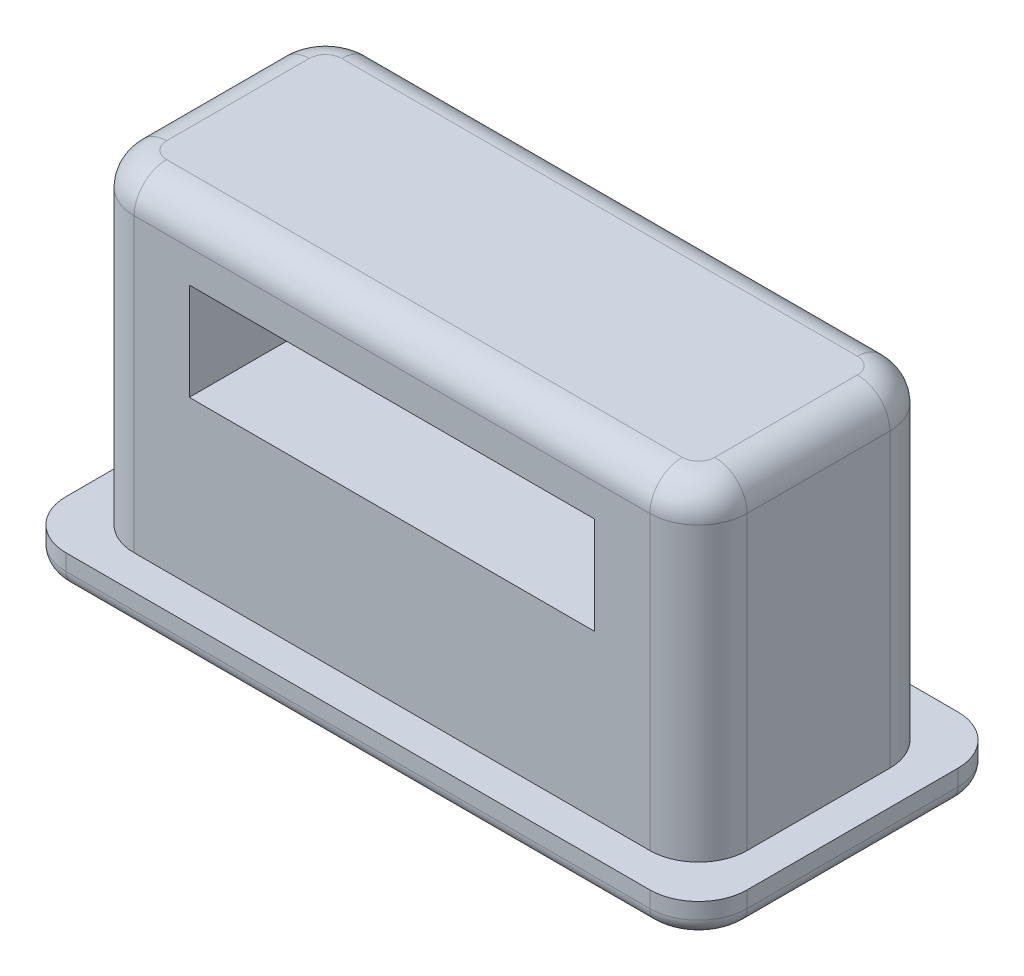
ISO-10303-21;
HEADER;
FILE_DESCRIPTION(('STEP AP214'),'2;1');
FILE_NAME('part.step','',(''),(''),'','','');
FILE_SCHEMA(('AUTOMOTIVE_DESIGN { 1 0 10303 214 1 1 1 1 }'));
ENDSEC;
DATA;
#1=APPLICATION_CONTEXT('core data for automotive mechanical design processes');
#2=APPLICATION_PROTOCOL_DEFINITION('international standard','automotive_design',2000,#1);
#3=PRODUCT_CONTEXT('',#1,'mechanical');
#4=PRODUCT('Part','Part','',(#3));
#5=PRODUCT_RELATED_PRODUCT_CATEGORY('part','',(#4));
#6=PRODUCT_DEFINITION_FORMATION('','',#4);
#7=PRODUCT_DEFINITION_CONTEXT('part definition',#1,'design');
#8=PRODUCT_DEFINITION('design','',#6,#7);
#9=PRODUCT_DEFINITION_SHAPE('','',#8);
#10=(LENGTH_UNIT() NAMED_UNIT(*) SI_UNIT(.MILLI.,.METRE.));
#11=(NAMED_UNIT(*) PLANE_ANGLE_UNIT() SI_UNIT($,.RADIAN.));
#12=(NAMED_UNIT(*) SI_UNIT($,.STERADIAN.) SOLID_ANGLE_UNIT());
#13=UNCERTAINTY_MEASURE_WITH_UNIT(LENGTH_MEASURE(1.E-05),#10,'distance_accuracy_value','');
#14=(GEOMETRIC_REPRESENTATION_CONTEXT(3) GLOBAL_UNCERTAINTY_ASSIGNED_CONTEXT((#13)) GLOBAL_UNIT_ASSIGNED_CONTEXT((#10,
#11,#12)) REPRESENTATION_CONTEXT('',''));
#15=CARTESIAN_POINT('',(0.,0.,0.));
#16=DIRECTION('',(0.,0.,1.));
#17=DIRECTION('',(1.,0.,0.));
#18=AXIS2_PLACEMENT_3D('',#15,#16,#17);
#19=CARTESIAN_POINT('',(-48.247676633875,22.,-13.3605958166485));
#20=DIRECTION('',(-1.,0.,0.));
#21=DIRECTION('',(0.,0.,1.));
#22=AXIS2_PLACEMENT_3D('',#19,#20,#21);
#23=PLANE('',#22);
#24=DIRECTION('',(0.,0.,-1.));
#25=VECTOR('',#24,1.);
#26=CARTESIAN_POINT('',(-48.247676633875,18.,1.43940418335151));
#27=LINE('',#26,#25);
#28=CARTESIAN_POINT('',(-48.247676633875,18.,1.43940418335151));
#29=VERTEX_POINT('',#28);
#30=CARTESIAN_POINT('',(-48.247676633875,18.,-13.3605958166485));
#31=VERTEX_POINT('',#30);
#32=EDGE_CURVE('E240',#29,#31,#27,.T.);
#33=ORIENTED_EDGE('',*,*,#32,.F.);
#34=DIRECTION('',(0.,-1.,0.));
#35=VECTOR('',#34,1.);
#36=CARTESIAN_POINT('',(-48.247676633875,22.,1.43940418335151));
#37=LINE('',#36,#35);
#38=CARTESIAN_POINT('',(-48.247676633875,12.,1.43940418335151));
#39=VERTEX_POINT('',#38);
#40=EDGE_CURVE('E239',#29,#39,#37,.T.);
#41=ORIENTED_EDGE('',*,*,#40,.T.);
#42=DIRECTION('',(0.,0.,-1.));
#43=VECTOR('',#42,1.);
#44=CARTESIAN_POINT('',(-48.247676633875,12.,-13.3605958166485));
#45=LINE('',#44,#43);
#46=CARTESIAN_POINT('',(-48.247676633875,12.,-13.3605958166485));
#47=VERTEX_POINT('',#46);
#48=EDGE_CURVE('E245',#39,#47,#45,.T.);
#49=ORIENTED_EDGE('',*,*,#48,.T.);
#50=DIRECTION('',(0.,-1.,0.));
#51=VECTOR('',#50,1.);
#52=CARTESIAN_POINT('',(-48.247676633875,22.,-13.3605958166485));
#53=LINE('',#52,#51);
#54=EDGE_CURVE('E267',#31,#47,#53,.T.);
#55=ORIENTED_EDGE('',*,*,#54,.F.);
#56=EDGE_LOOP('',(#33,#41,#49,#55));
#57=FACE_BOUND('',#56,.T.);
#58=ADVANCED_FACE('F34',(#57),#23,.F.);
#59=CARTESIAN_POINT('',(-23.247676633875,22.,-13.3605958166485));
#60=DIRECTION('',(1.,0.,0.));
#61=DIRECTION('',(0.,0.,-1.));
#62=AXIS2_PLACEMENT_3D('',#59,#60,#61);
#63=PLANE('',#62);
#64=DIRECTION('',(0.,0.,-1.));
#65=VECTOR('',#64,1.);
#66=CARTESIAN_POINT('',(-23.247676633875,18.,1.43940418335151));
#67=LINE('',#66,#65);
#68=CARTESIAN_POINT('',(-23.247676633875,18.,1.43940418335151));
#69=VERTEX_POINT('',#68);
#70=CARTESIAN_POINT('',(-23.247676633875,18.,-13.3605958166485));
#71=VERTEX_POINT('',#70);
#72=EDGE_CURVE('E220',#69,#71,#67,.T.);
#73=ORIENTED_EDGE('',*,*,#72,.T.);
#74=DIRECTION('',(0.,-1.,0.));
#75=VECTOR('',#74,1.);
#76=CARTESIAN_POINT('',(-23.247676633875,22.,-13.3605958166485));
#77=LINE('',#76,#75);
#78=CARTESIAN_POINT('',(-23.247676633875,12.,-13.3605958166485));
#79=VERTEX_POINT('',#78);
#80=EDGE_CURVE('E246',#71,#79,#77,.T.);
#81=ORIENTED_EDGE('',*,*,#80,.T.);
#82=DIRECTION('',(0.,0.,1.));
#83=VECTOR('',#82,1.);
#84=CARTESIAN_POINT('',(-23.247676633875,12.,-13.3605958166485));
#85=LINE('',#84,#83);
#86=CARTESIAN_POINT('',(-23.247676633875,12.,1.43940418335151));
#87=VERTEX_POINT('',#86);
#88=EDGE_CURVE('E230',#79,#87,#85,.T.);
#89=ORIENTED_EDGE('',*,*,#88,.T.);
#90=DIRECTION('',(0.,-1.,0.));
#91=VECTOR('',#90,1.);
#92=CARTESIAN_POINT('',(-23.247676633875,22.,1.43940418335151));
#93=LINE('',#92,#91);
#94=EDGE_CURVE('E237',#69,#87,#93,.T.);
#95=ORIENTED_EDGE('',*,*,#94,.F.);
#96=EDGE_LOOP('',(#73,#81,#89,#95));
#97=FACE_BOUND('',#96,.T.);
#98=ADVANCED_FACE('F243',(#97),#63,.F.);
#99=CARTESIAN_POINT('',(0.,12.,0.));
#100=DIRECTION('',(0.,1.,0.));
#101=DIRECTION('',(0.,0.,1.));
#102=AXIS2_PLACEMENT_3D('',#99,#100,#101);
#103=PLANE('',#102);
#104=DIRECTION('',(1.,0.,0.));
#105=VECTOR('',#104,1.);
#106=CARTESIAN_POINT('',(-54.647676633875,12.,1.43940418335151));
#107=LINE('',#106,#105);
#108=EDGE_CURVE('E378',#39,#87,#107,.T.);
#109=ORIENTED_EDGE('',*,*,#108,.T.);
#110=ORIENTED_EDGE('',*,*,#88,.F.);
#111=DIRECTION('',(-1.,0.,0.));
#112=VECTOR('',#111,1.);
#113=CARTESIAN_POINT('',(-54.647676633875,12.,-13.3605958166485));
#114=LINE('',#113,#112);
#115=EDGE_CURVE('E263',#79,#47,#114,.T.);
#116=ORIENTED_EDGE('',*,*,#115,.T.);
#117=ORIENTED_EDGE('',*,*,#48,.F.);
#118=EDGE_LOOP('',(#109,#110,#116,#117));
#119=FACE_BOUND('',#118,.T.);
#120=ADVANCED_FACE('F477',(#119),#103,.T.);
#121=CARTESIAN_POINT('',(0.,2.,0.));
#122=DIRECTION('',(0.,1.,0.));
#123=DIRECTION('',(0.,0.,1.));
#124=AXIS2_PLACEMENT_3D('',#121,#122,#123);
#125=PLANE('',#124);
#126=DIRECTION('',(-1.,0.,0.));
#127=VECTOR('',#126,1.);
#128=CARTESIAN_POINT('',(-56.747676633875,2.,-15.4605958166485));
#129=LINE('',#128,#127);
#130=CARTESIAN_POINT('',(-17.747676633875,2.,-15.4605958166485));
#131=VERTEX_POINT('',#130);
#132=CARTESIAN_POINT('',(-53.747676633875,2.,-15.4605958166485));
#133=VERTEX_POINT('',#132);
#134=EDGE_CURVE('E389',#131,#133,#129,.T.);
#135=ORIENTED_EDGE('',*,*,#134,.T.);
#136=CARTESIAN_POINT('',(-53.747676633875,2.,-12.4605958166485));
#137=DIRECTION('',(0.,1.,0.));
#138=DIRECTION('',(0.,0.,1.));
#139=AXIS2_PLACEMENT_3D('',#136,#137,#138);
#140=CIRCLE('',#139,3.);
#141=CARTESIAN_POINT('',(-56.747676633875,2.,-12.4605958166485));
#142=VERTEX_POINT('',#141);
#143=EDGE_CURVE('E408',#133,#142,#140,.T.);
#144=ORIENTED_EDGE('',*,*,#143,.T.);
#145=DIRECTION('',(0.,0.,1.));
#146=VECTOR('',#145,1.);
#147=CARTESIAN_POINT('',(-56.747676633875,2.,-15.4605958166485));
#148=LINE('',#147,#146);
#149=CARTESIAN_POINT('',(-56.747676633875,2.,0.539404183351508));
#150=VERTEX_POINT('',#149);
#151=EDGE_CURVE('E379',#142,#150,#148,.T.);
#152=ORIENTED_EDGE('',*,*,#151,.T.);
#153=CARTESIAN_POINT('',(-53.747676633875,2.,0.539404183351507));
#154=DIRECTION('',(0.,1.,0.));
#155=DIRECTION('',(0.,0.,1.));
#156=AXIS2_PLACEMENT_3D('',#153,#154,#155);
#157=CIRCLE('',#156,3.);
#158=CARTESIAN_POINT('',(-53.747676633875,2.,3.53940418335151));
#159=VERTEX_POINT('',#158);
#160=EDGE_CURVE('E406',#150,#159,#157,.T.);
#161=ORIENTED_EDGE('',*,*,#160,.T.);
#162=DIRECTION('',(1.,0.,0.));
#163=VECTOR('',#162,1.);
#164=CARTESIAN_POINT('',(-56.747676633875,2.,3.53940418335151));
#165=LINE('',#164,#163);
#166=CARTESIAN_POINT('',(-17.747676633875,2.,3.53940418335151));
#167=VERTEX_POINT('',#166);
#168=EDGE_CURVE('E382',#159,#167,#165,.T.);
#169=ORIENTED_EDGE('',*,*,#168,.T.);
#170=CARTESIAN_POINT('',(-17.747676633875,2.,0.539404183351508));
#171=DIRECTION('',(0.,1.,0.));
#172=DIRECTION('',(0.,0.,1.));
#173=AXIS2_PLACEMENT_3D('',#170,#171,#172);
#174=CIRCLE('',#173,3.);
#175=CARTESIAN_POINT('',(-14.747676633875,2.,0.539404183351508));
#176=VERTEX_POINT('',#175);
#177=EDGE_CURVE('E402',#167,#176,#174,.T.);
#178=ORIENTED_EDGE('',*,*,#177,.T.);
#179=DIRECTION('',(0.,0.,-1.));
#180=VECTOR('',#179,1.);
#181=CARTESIAN_POINT('',(-14.747676633875,2.,-15.4605958166485));
#182=LINE('',#181,#180);
#183=CARTESIAN_POINT('',(-14.747676633875,2.,-12.4605958166485));
#184=VERTEX_POINT('',#183);
#185=EDGE_CURVE('E386',#176,#184,#182,.T.);
#186=ORIENTED_EDGE('',*,*,#185,.T.);
#187=CARTESIAN_POINT('',(-17.747676633875,2.,-12.4605958166485));
#188=DIRECTION('',(0.,1.,0.));
#189=DIRECTION('',(0.,0.,1.));
#190=AXIS2_PLACEMENT_3D('',#187,#188,#189);
#191=CIRCLE('',#190,3.);
#192=EDGE_CURVE('E404',#184,#131,#191,.T.);
#193=ORIENTED_EDGE('',*,*,#192,.T.);
#194=EDGE_LOOP('',(#135,#144,#152,#161,#169,#178,#186,#193));
#195=FACE_BOUND('',#194,.T.);
#196=DIRECTION('',(1.,0.,0.));
#197=VECTOR('',#196,1.);
#198=CARTESIAN_POINT('',(-54.647676633875,2.,1.43940418335151));
#199=LINE('',#198,#197);
#200=CARTESIAN_POINT('',(-51.647676633875,2.,1.43940418335151));
#201=VERTEX_POINT('',#200);
#202=CARTESIAN_POINT('',(-19.847676633875,2.,1.43940418335151));
#203=VERTEX_POINT('',#202);
#204=EDGE_CURVE('E366',#201,#203,#199,.T.);
#205=ORIENTED_EDGE('',*,*,#204,.F.);
#206=CARTESIAN_POINT('',(-51.647676633875,2.,-1.56059581664849));
#207=DIRECTION('',(0.,1.,0.));
#208=DIRECTION('',(0.,0.,1.));
#209=AXIS2_PLACEMENT_3D('',#206,#207,#208);
#210=CIRCLE('',#209,3.);
#211=CARTESIAN_POINT('',(-54.647676633875,2.,-1.56059581664849));
#212=VERTEX_POINT('',#211);
#213=EDGE_CURVE('E293',#201,#212,#210,.F.);
#214=ORIENTED_EDGE('',*,*,#213,.T.);
#215=DIRECTION('',(0.,0.,1.));
#216=VECTOR('',#215,1.);
#217=CARTESIAN_POINT('',(-54.647676633875,2.,-13.3605958166485));
#218=LINE('',#217,#216);
#219=CARTESIAN_POINT('',(-54.647676633875,2.,-10.3605958166485));
#220=VERTEX_POINT('',#219);
#221=EDGE_CURVE('E363',#220,#212,#218,.T.);
#222=ORIENTED_EDGE('',*,*,#221,.F.);
#223=CARTESIAN_POINT('',(-51.647676633875,2.,-10.3605958166485));
#224=DIRECTION('',(0.,1.,0.));
#225=DIRECTION('',(0.,0.,1.));
#226=AXIS2_PLACEMENT_3D('',#223,#224,#225);
#227=CIRCLE('',#226,3.);
#228=CARTESIAN_POINT('',(-51.647676633875,2.,-13.3605958166485));
#229=VERTEX_POINT('',#228);
#230=EDGE_CURVE('E291',#220,#229,#227,.F.);
#231=ORIENTED_EDGE('',*,*,#230,.T.);
#232=DIRECTION('',(-1.,0.,0.));
#233=VECTOR('',#232,1.);
#234=CARTESIAN_POINT('',(-54.647676633875,2.,-13.3605958166485));
#235=LINE('',#234,#233);
#236=CARTESIAN_POINT('',(-19.847676633875,2.,-13.3605958166485));
#237=VERTEX_POINT('',#236);
#238=EDGE_CURVE('E375',#237,#229,#235,.T.);
#239=ORIENTED_EDGE('',*,*,#238,.F.);
#240=CARTESIAN_POINT('',(-19.847676633875,2.,-10.3605958166485));
#241=DIRECTION('',(0.,1.,0.));
#242=DIRECTION('',(0.,0.,1.));
#243=AXIS2_PLACEMENT_3D('',#240,#241,#242);
#244=CIRCLE('',#243,3.);
#245=CARTESIAN_POINT('',(-16.847676633875,2.,-10.3605958166485));
#246=VERTEX_POINT('',#245);
#247=EDGE_CURVE('E287',#237,#246,#244,.F.);
#248=ORIENTED_EDGE('',*,*,#247,.T.);
#249=DIRECTION('',(0.,0.,-1.));
#250=VECTOR('',#249,1.);
#251=CARTESIAN_POINT('',(-16.847676633875,2.,-13.3605958166485));
#252=LINE('',#251,#250);
#253=CARTESIAN_POINT('',(-16.847676633875,2.,-1.56059581664849));
#254=VERTEX_POINT('',#253);
#255=EDGE_CURVE('E369',#254,#246,#252,.T.);
#256=ORIENTED_EDGE('',*,*,#255,.F.);
#257=CARTESIAN_POINT('',(-19.847676633875,2.,-1.56059581664849));
#258=DIRECTION('',(0.,1.,0.));
#259=DIRECTION('',(0.,0.,1.));
#260=AXIS2_PLACEMENT_3D('',#257,#258,#259);
#261=CIRCLE('',#260,3.);
#262=EDGE_CURVE('E289',#254,#203,#261,.F.);
#263=ORIENTED_EDGE('',*,*,#262,.T.);
#264=EDGE_LOOP('',(#205,#214,#222,#231,#239,#248,#256,#263));
#265=FACE_BOUND('',#264,.T.);
#266=ADVANCED_FACE('F515',(#195,#265),#125,.T.);
#267=CARTESIAN_POINT('',(-56.747676633875,2.,-15.4605958166485));
#268=DIRECTION('',(1.,0.,0.));
#269=DIRECTION('',(0.,0.,-1.));
#270=AXIS2_PLACEMENT_3D('',#267,#268,#269);
#271=PLANE('',#270);
#272=DIRECTION('',(0.,-1.,0.));
#273=VECTOR('',#272,1.);
#274=CARTESIAN_POINT('',(-56.747676633875,2.,-12.4605958166485));
#275=LINE('',#274,#273);
#276=CARTESIAN_POINT('',(-56.747676633875,1.,-12.4605958166485));
#277=VERTEX_POINT('',#276);
#278=EDGE_CURVE('E394',#142,#277,#275,.T.);
#279=ORIENTED_EDGE('',*,*,#278,.T.);
#280=DIRECTION('',(0.,0.,1.));
#281=VECTOR('',#280,1.);
#282=CARTESIAN_POINT('',(-56.747676633875,1.,-15.4605958166485));
#283=LINE('',#282,#281);
#284=CARTESIAN_POINT('',(-56.747676633875,1.,0.539404183351508));
#285=VERTEX_POINT('',#284);
#286=EDGE_CURVE('E440',#277,#285,#283,.T.);
#287=ORIENTED_EDGE('',*,*,#286,.T.);
#288=DIRECTION('',(0.,-1.,0.));
#289=VECTOR('',#288,1.);
#290=CARTESIAN_POINT('',(-56.747676633875,2.,0.539404183351508));
#291=LINE('',#290,#289);
#292=EDGE_CURVE('E392',#285,#150,#291,.F.);
#293=ORIENTED_EDGE('',*,*,#292,.T.);
#294=ORIENTED_EDGE('',*,*,#151,.F.);
#295=EDGE_LOOP('',(#279,#287,#293,#294));
#296=FACE_BOUND('',#295,.T.);
#297=ADVANCED_FACE('F552',(#296),#271,.F.);
#298=CARTESIAN_POINT('',(-56.747676633875,2.,3.53940418335151));
#299=DIRECTION('',(0.,0.,-1.));
#300=DIRECTION('',(-1.,0.,0.));
#301=AXIS2_PLACEMENT_3D('',#298,#299,#300);
#302=PLANE('',#301);
#303=DIRECTION('',(0.,-1.,0.));
#304=VECTOR('',#303,1.);
#305=CARTESIAN_POINT('',(-53.747676633875,2.,3.53940418335151));
#306=LINE('',#305,#304);
#307=CARTESIAN_POINT('',(-53.747676633875,1.,3.53940418335151));
#308=VERTEX_POINT('',#307);
#309=EDGE_CURVE('E412',#159,#308,#306,.T.);
#310=ORIENTED_EDGE('',*,*,#309,.T.);
#311=DIRECTION('',(1.,0.,0.));
#312=VECTOR('',#311,1.);
#313=CARTESIAN_POINT('',(-56.747676633875,1.,3.53940418335151));
#314=LINE('',#313,#312);
#315=CARTESIAN_POINT('',(-17.747676633875,1.,3.53940418335151));
#316=VERTEX_POINT('',#315);
#317=EDGE_CURVE('E271',#308,#316,#314,.T.);
#318=ORIENTED_EDGE('',*,*,#317,.T.);
#319=DIRECTION('',(0.,-1.,0.));
#320=VECTOR('',#319,1.);
#321=CARTESIAN_POINT('',(-17.747676633875,2.,3.53940418335151));
#322=LINE('',#321,#320);
#323=EDGE_CURVE('E410',#316,#167,#322,.F.);
#324=ORIENTED_EDGE('',*,*,#323,.T.);
#325=ORIENTED_EDGE('',*,*,#168,.F.);
#326=EDGE_LOOP('',(#310,#318,#324,#325));
#327=FACE_BOUND('',#326,.T.);
#328=ADVANCED_FACE('F558',(#327),#302,.F.);
#329=CARTESIAN_POINT('',(-14.747676633875,2.,-15.4605958166485));
#330=DIRECTION('',(-1.,0.,0.));
#331=DIRECTION('',(0.,0.,1.));
#332=AXIS2_PLACEMENT_3D('',#329,#330,#331);
#333=PLANE('',#332);
#334=DIRECTION('',(0.,-1.,0.));
#335=VECTOR('',#334,1.);
#336=CARTESIAN_POINT('',(-14.747676633875,2.,0.539404183351508));
#337=LINE('',#336,#335);
#338=CARTESIAN_POINT('',(-14.747676633875,1.,0.539404183351508));
#339=VERTEX_POINT('',#338);
#340=EDGE_CURVE('E415',#176,#339,#337,.T.);
#341=ORIENTED_EDGE('',*,*,#340,.T.);
#342=DIRECTION('',(0.,0.,-1.));
#343=VECTOR('',#342,1.);
#344=CARTESIAN_POINT('',(-14.747676633875,1.,-15.4605958166485));
#345=LINE('',#344,#343);
#346=CARTESIAN_POINT('',(-14.747676633875,1.,-12.4605958166485));
#347=VERTEX_POINT('',#346);
#348=EDGE_CURVE('E448',#339,#347,#345,.T.);
#349=ORIENTED_EDGE('',*,*,#348,.T.);
#350=DIRECTION('',(0.,-1.,0.));
#351=VECTOR('',#350,1.);
#352=CARTESIAN_POINT('',(-14.747676633875,2.,-12.4605958166485));
#353=LINE('',#352,#351);
#354=EDGE_CURVE('E418',#347,#184,#353,.F.);
#355=ORIENTED_EDGE('',*,*,#354,.T.);
#356=ORIENTED_EDGE('',*,*,#185,.F.);
#357=EDGE_LOOP('',(#341,#349,#355,#356));
#358=FACE_BOUND('',#357,.T.);
#359=ADVANCED_FACE('F570',(#358),#333,.F.);
#360=CARTESIAN_POINT('',(-56.747676633875,2.,-15.4605958166485));
#361=DIRECTION('',(0.,0.,1.));
#362=DIRECTION('',(1.,0.,0.));
#363=AXIS2_PLACEMENT_3D('',#360,#361,#362);
#364=PLANE('',#363);
#365=DIRECTION('',(0.,-1.,0.));
#366=VECTOR('',#365,1.);
#367=CARTESIAN_POINT('',(-17.747676633875,2.,-15.4605958166485));
#368=LINE('',#367,#366);
#369=CARTESIAN_POINT('',(-17.747676633875,1.,-15.4605958166485));
#370=VERTEX_POINT('',#369);
#371=EDGE_CURVE('E397',#131,#370,#368,.T.);
#372=ORIENTED_EDGE('',*,*,#371,.T.);
#373=DIRECTION('',(-1.,0.,0.));
#374=VECTOR('',#373,1.);
#375=CARTESIAN_POINT('',(-56.747676633875,1.,-15.4605958166485));
#376=LINE('',#375,#374);
#377=CARTESIAN_POINT('',(-53.747676633875,1.,-15.4605958166485));
#378=VERTEX_POINT('',#377);
#379=EDGE_CURVE('E444',#370,#378,#376,.T.);
#380=ORIENTED_EDGE('',*,*,#379,.T.);
#381=DIRECTION('',(0.,-1.,0.));
#382=VECTOR('',#381,1.);
#383=CARTESIAN_POINT('',(-53.747676633875,2.,-15.4605958166485));
#384=LINE('',#383,#382);
#385=EDGE_CURVE('E400',#378,#133,#384,.F.);
#386=ORIENTED_EDGE('',*,*,#385,.T.);
#387=ORIENTED_EDGE('',*,*,#134,.F.);
#388=EDGE_LOOP('',(#372,#380,#386,#387));
#389=FACE_BOUND('',#388,.T.);
#390=ADVANCED_FACE('F566',(#389),#364,.F.);
#391=CARTESIAN_POINT('',(0.,0.,0.));
#392=DIRECTION('',(0.,1.,0.));
#393=DIRECTION('',(0.,0.,1.));
#394=AXIS2_PLACEMENT_3D('',#391,#392,#393);
#395=PLANE('',#394);
#396=DIRECTION('',(1.,0.,0.));
#397=VECTOR('',#396,1.);
#398=CARTESIAN_POINT('',(0.,0.,2.53940418335151));
#399=LINE('',#398,#397);
#400=CARTESIAN_POINT('',(-17.747676633875,0.,2.53940418335151));
#401=VERTEX_POINT('',#400);
#402=CARTESIAN_POINT('',(-53.747676633875,0.,2.53940418335151));
#403=VERTEX_POINT('',#402);
#404=EDGE_CURVE('E420',#401,#403,#399,.F.);
#405=ORIENTED_EDGE('',*,*,#404,.T.);
#406=CARTESIAN_POINT('',(-53.747676633875,0.,0.539404183351507));
#407=DIRECTION('',(0.,1.,0.));
#408=DIRECTION('',(0.,0.,1.));
#409=AXIS2_PLACEMENT_3D('',#406,#407,#408);
#410=CIRCLE('',#409,2.);
#411=CARTESIAN_POINT('',(-55.747676633875,0.,0.539404183351508));
#412=VERTEX_POINT('',#411);
#413=EDGE_CURVE('E434',#403,#412,#410,.F.);
#414=ORIENTED_EDGE('',*,*,#413,.T.);
#415=DIRECTION('',(0.,0.,1.));
#416=VECTOR('',#415,1.);
#417=CARTESIAN_POINT('',(-55.747676633875,0.,0.));
#418=LINE('',#417,#416);
#419=CARTESIAN_POINT('',(-55.747676633875,0.,-12.4605958166485));
#420=VERTEX_POINT('',#419);
#421=EDGE_CURVE('E432',#412,#420,#418,.F.);
#422=ORIENTED_EDGE('',*,*,#421,.T.);
#423=CARTESIAN_POINT('',(-53.747676633875,0.,-12.4605958166485));
#424=DIRECTION('',(0.,1.,0.));
#425=DIRECTION('',(0.,0.,1.));
#426=AXIS2_PLACEMENT_3D('',#423,#424,#425);
#427=CIRCLE('',#426,2.);
#428=CARTESIAN_POINT('',(-53.747676633875,0.,-14.4605958166485));
#429=VERTEX_POINT('',#428);
#430=EDGE_CURVE('E430',#420,#429,#427,.F.);
#431=ORIENTED_EDGE('',*,*,#430,.T.);
#432=DIRECTION('',(-1.,0.,0.));
#433=VECTOR('',#432,1.);
#434=CARTESIAN_POINT('',(0.,0.,-14.4605958166485));
#435=LINE('',#434,#433);
#436=CARTESIAN_POINT('',(-17.747676633875,0.,-14.4605958166485));
#437=VERTEX_POINT('',#436);
#438=EDGE_CURVE('E428',#429,#437,#435,.F.);
#439=ORIENTED_EDGE('',*,*,#438,.T.);
#440=CARTESIAN_POINT('',(-17.747676633875,0.,-12.4605958166485));
#441=DIRECTION('',(0.,1.,0.));
#442=DIRECTION('',(0.,0.,1.));
#443=AXIS2_PLACEMENT_3D('',#440,#441,#442);
#444=CIRCLE('',#443,2.);
#445=CARTESIAN_POINT('',(-15.747676633875,0.,-12.4605958166485));
#446=VERTEX_POINT('',#445);
#447=EDGE_CURVE('E426',#437,#446,#444,.F.);
#448=ORIENTED_EDGE('',*,*,#447,.T.);
#449=DIRECTION('',(0.,0.,-1.));
#450=VECTOR('',#449,1.);
#451=CARTESIAN_POINT('',(-15.747676633875,0.,0.));
#452=LINE('',#451,#450);
#453=CARTESIAN_POINT('',(-15.747676633875,0.,0.539404183351508));
#454=VERTEX_POINT('',#453);
#455=EDGE_CURVE('E424',#446,#454,#452,.F.);
#456=ORIENTED_EDGE('',*,*,#455,.T.);
#457=CARTESIAN_POINT('',(-17.747676633875,0.,0.539404183351508));
#458=DIRECTION('',(0.,1.,0.));
#459=DIRECTION('',(0.,0.,1.));
#460=AXIS2_PLACEMENT_3D('',#457,#458,#459);
#461=CIRCLE('',#460,2.);
#462=EDGE_CURVE('E422',#454,#401,#461,.F.);
#463=ORIENTED_EDGE('',*,*,#462,.T.);
#464=EDGE_LOOP('',(#405,#414,#422,#431,#439,#448,#456,#463));
#465=FACE_BOUND('',#464,.T.);
#466=ADVANCED_FACE('F562',(#465),#395,.F.);
#467=CARTESIAN_POINT('',(-53.747676633875,2.,-12.4605958166485));
#468=DIRECTION('',(0.,-1.,0.));
#469=DIRECTION('',(0.,0.,-1.));
#470=AXIS2_PLACEMENT_3D('',#467,#468,#469);
#471=CYLINDRICAL_SURFACE('',#470,3.);
#472=ORIENTED_EDGE('',*,*,#385,.F.);
#473=CARTESIAN_POINT('',(-53.747676633875,1.,-12.4605958166485));
#474=DIRECTION('',(0.,1.,0.));
#475=DIRECTION('',(0.,0.,1.));
#476=AXIS2_PLACEMENT_3D('',#473,#474,#475);
#477=CIRCLE('',#476,3.);
#478=EDGE_CURVE('E442',#378,#277,#477,.T.);
#479=ORIENTED_EDGE('',*,*,#478,.T.);
#480=ORIENTED_EDGE('',*,*,#278,.F.);
#481=ORIENTED_EDGE('',*,*,#143,.F.);
#482=EDGE_LOOP('',(#472,#479,#480,#481));
#483=FACE_BOUND('',#482,.T.);
#484=ADVANCED_FACE('F565',(#483),#471,.T.);
#485=CARTESIAN_POINT('',(-53.747676633875,2.,0.539404183351507));
#486=DIRECTION('',(0.,-1.,0.));
#487=DIRECTION('',(0.,0.,-1.));
#488=AXIS2_PLACEMENT_3D('',#485,#486,#487);
#489=CYLINDRICAL_SURFACE('',#488,3.);
#490=ORIENTED_EDGE('',*,*,#292,.F.);
#491=CARTESIAN_POINT('',(-53.747676633875,1.,0.539404183351507));
#492=DIRECTION('',(0.,1.,0.));
#493=DIRECTION('',(0.,0.,1.));
#494=AXIS2_PLACEMENT_3D('',#491,#492,#493);
#495=CIRCLE('',#494,3.);
#496=EDGE_CURVE('E437',#285,#308,#495,.T.);
#497=ORIENTED_EDGE('',*,*,#496,.T.);
#498=ORIENTED_EDGE('',*,*,#309,.F.);
#499=ORIENTED_EDGE('',*,*,#160,.F.);
#500=EDGE_LOOP('',(#490,#497,#498,#499));
#501=FACE_BOUND('',#500,.T.);
#502=ADVANCED_FACE('F580',(#501),#489,.T.);
#503=CARTESIAN_POINT('',(-17.747676633875,2.,-12.4605958166485));
#504=DIRECTION('',(0.,-1.,0.));
#505=DIRECTION('',(0.,0.,-1.));
#506=AXIS2_PLACEMENT_3D('',#503,#504,#505);
#507=CYLINDRICAL_SURFACE('',#506,3.);
#508=ORIENTED_EDGE('',*,*,#354,.F.);
#509=CARTESIAN_POINT('',(-17.747676633875,1.,-12.4605958166485));
#510=DIRECTION('',(0.,1.,0.));
#511=DIRECTION('',(0.,0.,1.));
#512=AXIS2_PLACEMENT_3D('',#509,#510,#511);
#513=CIRCLE('',#512,3.);
#514=EDGE_CURVE('E446',#347,#370,#513,.T.);
#515=ORIENTED_EDGE('',*,*,#514,.T.);
#516=ORIENTED_EDGE('',*,*,#371,.F.);
#517=ORIENTED_EDGE('',*,*,#192,.F.);
#518=EDGE_LOOP('',(#508,#515,#516,#517));
#519=FACE_BOUND('',#518,.T.);
#520=ADVANCED_FACE('F584',(#519),#507,.T.);
#521=CARTESIAN_POINT('',(-17.747676633875,2.,0.539404183351508));
#522=DIRECTION('',(0.,-1.,0.));
#523=DIRECTION('',(0.,0.,-1.));
#524=AXIS2_PLACEMENT_3D('',#521,#522,#523);
#525=CYLINDRICAL_SURFACE('',#524,3.);
#526=ORIENTED_EDGE('',*,*,#323,.F.);
#527=CARTESIAN_POINT('',(-17.747676633875,1.,0.539404183351508));
#528=DIRECTION('',(0.,1.,0.));
#529=DIRECTION('',(0.,0.,1.));
#530=AXIS2_PLACEMENT_3D('',#527,#528,#529);
#531=CIRCLE('',#530,3.);
#532=EDGE_CURVE('E450',#316,#339,#531,.T.);
#533=ORIENTED_EDGE('',*,*,#532,.T.);
#534=ORIENTED_EDGE('',*,*,#340,.F.);
#535=ORIENTED_EDGE('',*,*,#177,.F.);
#536=EDGE_LOOP('',(#526,#533,#534,#535));
#537=FACE_BOUND('',#536,.T.);
#538=ADVANCED_FACE('F588',(#537),#525,.T.);
#539=CARTESIAN_POINT('',(-17.747676633875,1.,-12.4605958166485));
#540=DIRECTION('',(0.,1.,0.));
#541=DIRECTION('',(0.,0.,1.));
#542=AXIS2_PLACEMENT_3D('',#539,#540,#541);
#543=TOROIDAL_SURFACE('',#542,2.,1.);
#544=CARTESIAN_POINT('',(-17.747676633875,1.,-14.4605958166485));
#545=DIRECTION('',(-1.,0.,0.));
#546=DIRECTION('',(0.,0.,1.));
#547=AXIS2_PLACEMENT_3D('',#544,#545,#546);
#548=CIRCLE('',#547,1.);
#549=EDGE_CURVE('E469',#370,#437,#548,.T.);
#550=ORIENTED_EDGE('',*,*,#549,.F.);
#551=ORIENTED_EDGE('',*,*,#514,.F.);
#552=CARTESIAN_POINT('',(-15.747676633875,1.,-12.4605958166485));
#553=DIRECTION('',(0.,0.,1.));
#554=DIRECTION('',(1.,0.,0.));
#555=AXIS2_PLACEMENT_3D('',#552,#553,#554);
#556=CIRCLE('',#555,1.);
#557=EDGE_CURVE('E383',#446,#347,#556,.T.);
#558=ORIENTED_EDGE('',*,*,#557,.F.);
#559=ORIENTED_EDGE('',*,*,#447,.F.);
#560=EDGE_LOOP('',(#550,#551,#558,#559));
#561=FACE_BOUND('',#560,.T.);
#562=ADVANCED_FACE('F592',(#561),#543,.T.);
#563=CARTESIAN_POINT('',(-15.747676633875,1.,-15.4605958166485));
#564=DIRECTION('',(0.,0.,-1.));
#565=DIRECTION('',(-1.,0.,0.));
#566=AXIS2_PLACEMENT_3D('',#563,#564,#565);
#567=CYLINDRICAL_SURFACE('',#566,1.);
#568=ORIENTED_EDGE('',*,*,#557,.T.);
#569=ORIENTED_EDGE('',*,*,#348,.F.);
#570=CARTESIAN_POINT('',(-15.747676633875,1.,0.539404183351508));
#571=DIRECTION('',(0.,0.,1.));
#572=DIRECTION('',(1.,0.,0.));
#573=AXIS2_PLACEMENT_3D('',#570,#571,#572);
#574=CIRCLE('',#573,1.);
#575=EDGE_CURVE('E466',#454,#339,#574,.T.);
#576=ORIENTED_EDGE('',*,*,#575,.F.);
#577=ORIENTED_EDGE('',*,*,#455,.F.);
#578=EDGE_LOOP('',(#568,#569,#576,#577));
#579=FACE_BOUND('',#578,.T.);
#580=ADVANCED_FACE('F616',(#579),#567,.T.);
#581=CARTESIAN_POINT('',(-56.747676633875,1.,-14.4605958166485));
#582=DIRECTION('',(-1.,0.,0.));
#583=DIRECTION('',(0.,0.,1.));
#584=AXIS2_PLACEMENT_3D('',#581,#582,#583);
#585=CYLINDRICAL_SURFACE('',#584,1.);
#586=ORIENTED_EDGE('',*,*,#549,.T.);
#587=ORIENTED_EDGE('',*,*,#438,.F.);
#588=CARTESIAN_POINT('',(-53.747676633875,1.,-14.4605958166485));
#589=DIRECTION('',(-1.,0.,0.));
#590=DIRECTION('',(0.,0.,1.));
#591=AXIS2_PLACEMENT_3D('',#588,#589,#590);
#592=CIRCLE('',#591,1.);
#593=EDGE_CURVE('E463',#378,#429,#592,.T.);
#594=ORIENTED_EDGE('',*,*,#593,.F.);
#595=ORIENTED_EDGE('',*,*,#379,.F.);
#596=EDGE_LOOP('',(#586,#587,#594,#595));
#597=FACE_BOUND('',#596,.T.);
#598=ADVANCED_FACE('F612',(#597),#585,.T.);
#599=CARTESIAN_POINT('',(-17.747676633875,1.,0.539404183351508));
#600=DIRECTION('',(0.,1.,0.));
#601=DIRECTION('',(0.,0.,1.));
#602=AXIS2_PLACEMENT_3D('',#599,#600,#601);
#603=TOROIDAL_SURFACE('',#602,2.,1.);
#604=ORIENTED_EDGE('',*,*,#575,.T.);
#605=ORIENTED_EDGE('',*,*,#532,.F.);
#606=CARTESIAN_POINT('',(-17.747676633875,1.,2.53940418335151));
#607=DIRECTION('',(-1.,0.,0.));
#608=DIRECTION('',(0.,0.,1.));
#609=AXIS2_PLACEMENT_3D('',#606,#607,#608);
#610=CIRCLE('',#609,1.);
#611=EDGE_CURVE('E460',#401,#316,#610,.T.);
#612=ORIENTED_EDGE('',*,*,#611,.F.);
#613=ORIENTED_EDGE('',*,*,#462,.F.);
#614=EDGE_LOOP('',(#604,#605,#612,#613));
#615=FACE_BOUND('',#614,.T.);
#616=ADVANCED_FACE('F608',(#615),#603,.T.);
#617=CARTESIAN_POINT('',(-53.747676633875,1.,-12.4605958166485));
#618=DIRECTION('',(0.,1.,0.));
#619=DIRECTION('',(0.,0.,1.));
#620=AXIS2_PLACEMENT_3D('',#617,#618,#619);
#621=TOROIDAL_SURFACE('',#620,2.,1.);
#622=ORIENTED_EDGE('',*,*,#593,.T.);
#623=ORIENTED_EDGE('',*,*,#430,.F.);
#624=CARTESIAN_POINT('',(-55.747676633875,1.,-12.4605958166485));
#625=DIRECTION('',(0.,0.,1.));
#626=DIRECTION('',(1.,0.,0.));
#627=AXIS2_PLACEMENT_3D('',#624,#625,#626);
#628=CIRCLE('',#627,1.);
#629=EDGE_CURVE('E457',#277,#420,#628,.T.);
#630=ORIENTED_EDGE('',*,*,#629,.F.);
#631=ORIENTED_EDGE('',*,*,#478,.F.);
#632=EDGE_LOOP('',(#622,#623,#630,#631));
#633=FACE_BOUND('',#632,.T.);
#634=ADVANCED_FACE('F604',(#633),#621,.T.);
#635=CARTESIAN_POINT('',(-56.747676633875,1.,2.53940418335151));
#636=DIRECTION('',(1.,0.,0.));
#637=DIRECTION('',(0.,0.,-1.));
#638=AXIS2_PLACEMENT_3D('',#635,#636,#637);
#639=CYLINDRICAL_SURFACE('',#638,1.);
#640=ORIENTED_EDGE('',*,*,#611,.T.);
#641=ORIENTED_EDGE('',*,*,#317,.F.);
#642=CARTESIAN_POINT('',(-53.747676633875,1.,2.53940418335151));
#643=DIRECTION('',(-1.,0.,0.));
#644=DIRECTION('',(0.,0.,1.));
#645=AXIS2_PLACEMENT_3D('',#642,#643,#644);
#646=CIRCLE('',#645,1.);
#647=EDGE_CURVE('E455',#403,#308,#646,.T.);
#648=ORIENTED_EDGE('',*,*,#647,.F.);
#649=ORIENTED_EDGE('',*,*,#404,.F.);
#650=EDGE_LOOP('',(#640,#641,#648,#649));
#651=FACE_BOUND('',#650,.T.);
#652=ADVANCED_FACE('F600',(#651),#639,.T.);
#653=CARTESIAN_POINT('',(-55.747676633875,1.,-15.4605958166485));
#654=DIRECTION('',(0.,0.,1.));
#655=DIRECTION('',(1.,0.,0.));
#656=AXIS2_PLACEMENT_3D('',#653,#654,#655);
#657=CYLINDRICAL_SURFACE('',#656,1.);
#658=ORIENTED_EDGE('',*,*,#629,.T.);
#659=ORIENTED_EDGE('',*,*,#421,.F.);
#660=CARTESIAN_POINT('',(-55.747676633875,1.,0.539404183351508));
#661=DIRECTION('',(0.,0.,1.));
#662=DIRECTION('',(0.,-1.,0.));
#663=AXIS2_PLACEMENT_3D('',#660,#661,#662);
#664=CIRCLE('',#663,1.);
#665=EDGE_CURVE('E453',#285,#412,#664,.T.);
#666=ORIENTED_EDGE('',*,*,#665,.F.);
#667=ORIENTED_EDGE('',*,*,#286,.F.);
#668=EDGE_LOOP('',(#658,#659,#666,#667));
#669=FACE_BOUND('',#668,.T.);
#670=ADVANCED_FACE('F596',(#669),#657,.T.);
#671=CARTESIAN_POINT('',(-53.747676633875,1.,0.539404183351507));
#672=DIRECTION('',(0.,1.,0.));
#673=DIRECTION('',(0.,0.,1.));
#674=AXIS2_PLACEMENT_3D('',#671,#672,#673);
#675=TOROIDAL_SURFACE('',#674,2.,1.);
#676=ORIENTED_EDGE('',*,*,#647,.T.);
#677=ORIENTED_EDGE('',*,*,#496,.F.);
#678=ORIENTED_EDGE('',*,*,#665,.T.);
#679=ORIENTED_EDGE('',*,*,#413,.F.);
#680=EDGE_LOOP('',(#676,#677,#678,#679));
#681=FACE_BOUND('',#680,.T.);
#682=ADVANCED_FACE('F538',(#681),#675,.T.);
#683=CARTESIAN_POINT('',(-54.647676633875,12.,-13.3605958166485));
#684=DIRECTION('',(1.,0.,0.));
#685=DIRECTION('',(0.,0.,-1.));
#686=AXIS2_PLACEMENT_3D('',#683,#684,#685);
#687=PLANE('',#686);
#688=DIRECTION('',(0.,-1.,0.));
#689=VECTOR('',#688,1.);
#690=CARTESIAN_POINT('',(-54.647676633875,12.,-1.56059581664849));
#691=LINE('',#690,#689);
#692=CARTESIAN_POINT('',(-54.647676633875,20.,-1.56059581664849));
#693=VERTEX_POINT('',#692);
#694=EDGE_CURVE('E283',#212,#693,#691,.F.);
#695=ORIENTED_EDGE('',*,*,#694,.T.);
#696=DIRECTION('',(0.,0.,1.));
#697=VECTOR('',#696,1.);
#698=CARTESIAN_POINT('',(-54.647676633875,20.,-10.3605958166485));
#699=LINE('',#698,#697);
#700=CARTESIAN_POINT('',(-54.647676633875,20.,-10.3605958166485));
#701=VERTEX_POINT('',#700);
#702=EDGE_CURVE('E58',#693,#701,#699,.F.);
#703=ORIENTED_EDGE('',*,*,#702,.T.);
#704=DIRECTION('',(0.,-1.,0.));
#705=VECTOR('',#704,1.);
#706=CARTESIAN_POINT('',(-54.647676633875,12.,-10.3605958166485));
#707=LINE('',#706,#705);
#708=EDGE_CURVE('E285',#701,#220,#707,.T.);
#709=ORIENTED_EDGE('',*,*,#708,.T.);
#710=ORIENTED_EDGE('',*,*,#221,.T.);
#711=EDGE_LOOP('',(#695,#703,#709,#710));
#712=FACE_BOUND('',#711,.T.);
#713=ADVANCED_FACE('F361',(#712),#687,.F.);
#714=CARTESIAN_POINT('',(-54.647676633875,12.,1.43940418335151));
#715=DIRECTION('',(0.,0.,-1.));
#716=DIRECTION('',(-1.,0.,0.));
#717=AXIS2_PLACEMENT_3D('',#714,#715,#716);
#718=PLANE('',#717);
#719=ORIENTED_EDGE('',*,*,#40,.F.);
#720=DIRECTION('',(-1.,0.,0.));
#721=VECTOR('',#720,1.);
#722=CARTESIAN_POINT('',(-7.91666231648556,18.,1.43940418335151));
#723=LINE('',#722,#721);
#724=EDGE_CURVE('E224',#69,#29,#723,.T.);
#725=ORIENTED_EDGE('',*,*,#724,.F.);
#726=ORIENTED_EDGE('',*,*,#94,.T.);
#727=ORIENTED_EDGE('',*,*,#108,.F.);
#728=EDGE_LOOP('',(#719,#725,#726,#727));
#729=FACE_BOUND('',#728,.T.);
#730=DIRECTION('',(0.,-1.,0.));
#731=VECTOR('',#730,1.);
#732=CARTESIAN_POINT('',(-19.847676633875,12.,1.43940418335151));
#733=LINE('',#732,#731);
#734=CARTESIAN_POINT('',(-19.847676633875,20.,1.43940418335151));
#735=VERTEX_POINT('',#734);
#736=EDGE_CURVE('E280',#203,#735,#733,.F.);
#737=ORIENTED_EDGE('',*,*,#736,.T.);
#738=DIRECTION('',(1.,0.,0.));
#739=VECTOR('',#738,1.);
#740=CARTESIAN_POINT('',(-51.647676633875,20.,1.43940418335151));
#741=LINE('',#740,#739);
#742=CARTESIAN_POINT('',(-51.647676633875,20.,1.43940418335151));
#743=VERTEX_POINT('',#742);
#744=EDGE_CURVE('E319',#735,#743,#741,.F.);
#745=ORIENTED_EDGE('',*,*,#744,.T.);
#746=DIRECTION('',(0.,-1.,0.));
#747=VECTOR('',#746,1.);
#748=CARTESIAN_POINT('',(-51.647676633875,12.,1.43940418335151));
#749=LINE('',#748,#747);
#750=EDGE_CURVE('E278',#743,#201,#749,.T.);
#751=ORIENTED_EDGE('',*,*,#750,.T.);
#752=ORIENTED_EDGE('',*,*,#204,.T.);
#753=EDGE_LOOP('',(#737,#745,#751,#752));
#754=FACE_BOUND('',#753,.T.);
#755=ADVANCED_FACE('F234',(#729,#754),#718,.F.);
#756=CARTESIAN_POINT('',(-16.847676633875,12.,-13.3605958166485));
#757=DIRECTION('',(-1.,0.,0.));
#758=DIRECTION('',(0.,0.,1.));
#759=AXIS2_PLACEMENT_3D('',#756,#757,#758);
#760=PLANE('',#759);
#761=DIRECTION('',(0.,-1.,0.));
#762=VECTOR('',#761,1.);
#763=CARTESIAN_POINT('',(-16.847676633875,12.,-10.3605958166485));
#764=LINE('',#763,#762);
#765=CARTESIAN_POINT('',(-16.847676633875,20.,-10.3605958166485));
#766=VERTEX_POINT('',#765);
#767=EDGE_CURVE('E275',#246,#766,#764,.F.);
#768=ORIENTED_EDGE('',*,*,#767,.T.);
#769=DIRECTION('',(0.,0.,-1.));
#770=VECTOR('',#769,1.);
#771=CARTESIAN_POINT('',(-16.847676633875,20.,-1.56059581664849));
#772=LINE('',#771,#770);
#773=CARTESIAN_POINT('',(-16.847676633875,20.,-1.56059581664849));
#774=VERTEX_POINT('',#773);
#775=EDGE_CURVE('E315',#766,#774,#772,.F.);
#776=ORIENTED_EDGE('',*,*,#775,.T.);
#777=DIRECTION('',(0.,-1.,0.));
#778=VECTOR('',#777,1.);
#779=CARTESIAN_POINT('',(-16.847676633875,12.,-1.56059581664849));
#780=LINE('',#779,#778);
#781=EDGE_CURVE('E273',#774,#254,#780,.T.);
#782=ORIENTED_EDGE('',*,*,#781,.T.);
#783=ORIENTED_EDGE('',*,*,#255,.T.);
#784=EDGE_LOOP('',(#768,#776,#782,#783));
#785=FACE_BOUND('',#784,.T.);
#786=ADVANCED_FACE('F487',(#785),#760,.F.);
#787=CARTESIAN_POINT('',(-54.647676633875,12.,-13.3605958166485));
#788=DIRECTION('',(0.,0.,1.));
#789=DIRECTION('',(1.,0.,0.));
#790=AXIS2_PLACEMENT_3D('',#787,#788,#789);
#791=PLANE('',#790);
#792=DIRECTION('',(-1.,0.,0.));
#793=VECTOR('',#792,1.);
#794=CARTESIAN_POINT('',(-7.91666231648556,18.,-13.3605958166485));
#795=LINE('',#794,#793);
#796=EDGE_CURVE('E226',#71,#31,#795,.T.);
#797=ORIENTED_EDGE('',*,*,#796,.T.);
#798=ORIENTED_EDGE('',*,*,#54,.T.);
#799=ORIENTED_EDGE('',*,*,#115,.F.);
#800=ORIENTED_EDGE('',*,*,#80,.F.);
#801=EDGE_LOOP('',(#797,#798,#799,#800));
#802=FACE_BOUND('',#801,.T.);
#803=DIRECTION('',(0.,-1.,0.));
#804=VECTOR('',#803,1.);
#805=CARTESIAN_POINT('',(-51.647676633875,12.,-13.3605958166485));
#806=LINE('',#805,#804);
#807=CARTESIAN_POINT('',(-51.647676633875,20.,-13.3605958166485));
#808=VERTEX_POINT('',#807);
#809=EDGE_CURVE('E268',#229,#808,#806,.F.);
#810=ORIENTED_EDGE('',*,*,#809,.T.);
#811=DIRECTION('',(-1.,0.,0.));
#812=VECTOR('',#811,1.);
#813=CARTESIAN_POINT('',(-19.847676633875,20.,-13.3605958166485));
#814=LINE('',#813,#812);
#815=CARTESIAN_POINT('',(-19.847676633875,20.,-13.3605958166485));
#816=VERTEX_POINT('',#815);
#817=EDGE_CURVE('E11',#808,#816,#814,.F.);
#818=ORIENTED_EDGE('',*,*,#817,.T.);
#819=DIRECTION('',(0.,-1.,0.));
#820=VECTOR('',#819,1.);
#821=CARTESIAN_POINT('',(-19.847676633875,12.,-13.3605958166485));
#822=LINE('',#821,#820);
#823=EDGE_CURVE('E270',#816,#237,#822,.T.);
#824=ORIENTED_EDGE('',*,*,#823,.T.);
#825=ORIENTED_EDGE('',*,*,#238,.T.);
#826=EDGE_LOOP('',(#810,#818,#824,#825));
#827=FACE_BOUND('',#826,.T.);
#828=ADVANCED_FACE('F483',(#802,#827),#791,.F.);
#829=CARTESIAN_POINT('',(0.,22.,0.));
#830=DIRECTION('',(0.,1.,0.));
#831=DIRECTION('',(0.,0.,1.));
#832=AXIS2_PLACEMENT_3D('',#829,#830,#831);
#833=PLANE('',#832);
#834=DIRECTION('',(0.,0.,-1.));
#835=VECTOR('',#834,1.);
#836=CARTESIAN_POINT('',(-18.847676633875,22.,-10.3605958166485));
#837=LINE('',#836,#835);
#838=CARTESIAN_POINT('',(-18.847676633875,22.,-1.56059581664849));
#839=VERTEX_POINT('',#838);
#840=CARTESIAN_POINT('',(-18.847676633875,22.,-10.3605958166485));
#841=VERTEX_POINT('',#840);
#842=EDGE_CURVE('E307',#839,#841,#837,.T.);
#843=ORIENTED_EDGE('',*,*,#842,.T.);
#844=CARTESIAN_POINT('',(-19.847676633875,22.,-10.3605958166485));
#845=DIRECTION('',(0.,1.,0.));
#846=DIRECTION('',(0.,0.,1.));
#847=AXIS2_PLACEMENT_3D('',#844,#845,#846);
#848=CIRCLE('',#847,1.);
#849=CARTESIAN_POINT('',(-19.847676633875,22.,-11.3605958166485));
#850=VERTEX_POINT('',#849);
#851=EDGE_CURVE('E309',#841,#850,#848,.T.);
#852=ORIENTED_EDGE('',*,*,#851,.T.);
#853=DIRECTION('',(-1.,0.,0.));
#854=VECTOR('',#853,1.);
#855=CARTESIAN_POINT('',(-51.647676633875,22.,-11.3605958166485));
#856=LINE('',#855,#854);
#857=CARTESIAN_POINT('',(-51.647676633875,22.,-11.3605958166485));
#858=VERTEX_POINT('',#857);
#859=EDGE_CURVE('E295',#850,#858,#856,.T.);
#860=ORIENTED_EDGE('',*,*,#859,.T.);
#861=CARTESIAN_POINT('',(-51.647676633875,22.,-10.3605958166485));
#862=DIRECTION('',(0.,1.,0.));
#863=DIRECTION('',(0.,0.,1.));
#864=AXIS2_PLACEMENT_3D('',#861,#862,#863);
#865=CIRCLE('',#864,1.);
#866=CARTESIAN_POINT('',(-52.647676633875,22.,-10.3605958166485));
#867=VERTEX_POINT('',#866);
#868=EDGE_CURVE('E297',#858,#867,#865,.T.);
#869=ORIENTED_EDGE('',*,*,#868,.T.);
#870=DIRECTION('',(0.,0.,1.));
#871=VECTOR('',#870,1.);
#872=CARTESIAN_POINT('',(-52.647676633875,22.,-1.56059581664849));
#873=LINE('',#872,#871);
#874=CARTESIAN_POINT('',(-52.647676633875,22.,-1.56059581664849));
#875=VERTEX_POINT('',#874);
#876=EDGE_CURVE('E299',#867,#875,#873,.T.);
#877=ORIENTED_EDGE('',*,*,#876,.T.);
#878=CARTESIAN_POINT('',(-51.647676633875,22.,-1.56059581664849));
#879=DIRECTION('',(0.,1.,0.));
#880=DIRECTION('',(0.,0.,1.));
#881=AXIS2_PLACEMENT_3D('',#878,#879,#880);
#882=CIRCLE('',#881,1.);
#883=CARTESIAN_POINT('',(-51.647676633875,22.,-0.560595816648491));
#884=VERTEX_POINT('',#883);
#885=EDGE_CURVE('E301',#875,#884,#882,.T.);
#886=ORIENTED_EDGE('',*,*,#885,.T.);
#887=DIRECTION('',(1.,0.,0.));
#888=VECTOR('',#887,1.);
#889=CARTESIAN_POINT('',(-19.847676633875,22.,-0.560595816648491));
#890=LINE('',#889,#888);
#891=CARTESIAN_POINT('',(-19.847676633875,22.,-0.560595816648491));
#892=VERTEX_POINT('',#891);
#893=EDGE_CURVE('E303',#884,#892,#890,.T.);
#894=ORIENTED_EDGE('',*,*,#893,.T.);
#895=CARTESIAN_POINT('',(-19.847676633875,22.,-1.56059581664849));
#896=DIRECTION('',(0.,1.,0.));
#897=DIRECTION('',(0.,0.,1.));
#898=AXIS2_PLACEMENT_3D('',#895,#896,#897);
#899=CIRCLE('',#898,1.);
#900=EDGE_CURVE('E305',#892,#839,#899,.T.);
#901=ORIENTED_EDGE('',*,*,#900,.T.);
#902=EDGE_LOOP('',(#843,#852,#860,#869,#877,#886,#894,#901));
#903=FACE_BOUND('',#902,.T.);
#904=ADVANCED_FACE('F486',(#903),#833,.T.);
#905=CARTESIAN_POINT('',(-7.91666231648556,18.,1.43940418335151));
#906=DIRECTION('',(0.,1.,0.));
#907=DIRECTION('',(0.,0.,1.));
#908=AXIS2_PLACEMENT_3D('',#905,#906,#907);
#909=PLANE('',#908);
#910=ORIENTED_EDGE('',*,*,#72,.F.);
#911=ORIENTED_EDGE('',*,*,#724,.T.);
#912=ORIENTED_EDGE('',*,*,#32,.T.);
#913=ORIENTED_EDGE('',*,*,#796,.F.);
#914=EDGE_LOOP('',(#910,#911,#912,#913));
#915=FACE_BOUND('',#914,.T.);
#916=ADVANCED_FACE('F222',(#915),#909,.F.);
#917=CARTESIAN_POINT('',(-19.847676633875,12.,-10.3605958166485));
#918=DIRECTION('',(0.,-1.,0.));
#919=DIRECTION('',(0.,0.,-1.));
#920=AXIS2_PLACEMENT_3D('',#917,#918,#919);
#921=CYLINDRICAL_SURFACE('',#920,3.);
#922=ORIENTED_EDGE('',*,*,#823,.F.);
#923=CARTESIAN_POINT('',(-19.847676633875,20.,-10.3605958166485));
#924=DIRECTION('',(0.,1.,0.));
#925=DIRECTION('',(0.,0.,1.));
#926=AXIS2_PLACEMENT_3D('',#923,#924,#925);
#927=CIRCLE('',#926,3.);
#928=EDGE_CURVE('E312',#816,#766,#927,.F.);
#929=ORIENTED_EDGE('',*,*,#928,.T.);
#930=ORIENTED_EDGE('',*,*,#767,.F.);
#931=ORIENTED_EDGE('',*,*,#247,.F.);
#932=EDGE_LOOP('',(#922,#929,#930,#931));
#933=FACE_BOUND('',#932,.T.);
#934=ADVANCED_FACE('F508',(#933),#921,.T.);
#935=CARTESIAN_POINT('',(-19.847676633875,12.,-1.56059581664849));
#936=DIRECTION('',(0.,-1.,0.));
#937=DIRECTION('',(0.,0.,-1.));
#938=AXIS2_PLACEMENT_3D('',#935,#936,#937);
#939=CYLINDRICAL_SURFACE('',#938,3.);
#940=ORIENTED_EDGE('',*,*,#781,.F.);
#941=CARTESIAN_POINT('',(-19.847676633875,20.,-1.56059581664849));
#942=DIRECTION('',(0.,1.,0.));
#943=DIRECTION('',(0.,0.,1.));
#944=AXIS2_PLACEMENT_3D('',#941,#942,#943);
#945=CIRCLE('',#944,3.);
#946=EDGE_CURVE('E317',#774,#735,#945,.F.);
#947=ORIENTED_EDGE('',*,*,#946,.T.);
#948=ORIENTED_EDGE('',*,*,#736,.F.);
#949=ORIENTED_EDGE('',*,*,#262,.F.);
#950=EDGE_LOOP('',(#940,#947,#948,#949));
#951=FACE_BOUND('',#950,.T.);
#952=ADVANCED_FACE('F530',(#951),#939,.T.);
#953=CARTESIAN_POINT('',(-51.647676633875,12.,-10.3605958166485));
#954=DIRECTION('',(0.,-1.,0.));
#955=DIRECTION('',(0.,0.,-1.));
#956=AXIS2_PLACEMENT_3D('',#953,#954,#955);
#957=CYLINDRICAL_SURFACE('',#956,3.);
#958=ORIENTED_EDGE('',*,*,#708,.F.);
#959=CARTESIAN_POINT('',(-51.647676633875,20.,-10.3605958166485));
#960=DIRECTION('',(0.,1.,0.));
#961=DIRECTION('',(0.,0.,1.));
#962=AXIS2_PLACEMENT_3D('',#959,#960,#961);
#963=CIRCLE('',#962,3.);
#964=EDGE_CURVE('E43',#701,#808,#963,.F.);
#965=ORIENTED_EDGE('',*,*,#964,.T.);
#966=ORIENTED_EDGE('',*,*,#809,.F.);
#967=ORIENTED_EDGE('',*,*,#230,.F.);
#968=EDGE_LOOP('',(#958,#965,#966,#967));
#969=FACE_BOUND('',#968,.T.);
#970=ADVANCED_FACE('F516',(#969),#957,.T.);
#971=CARTESIAN_POINT('',(-51.647676633875,12.,-1.56059581664849));
#972=DIRECTION('',(0.,-1.,0.));
#973=DIRECTION('',(0.,0.,-1.));
#974=AXIS2_PLACEMENT_3D('',#971,#972,#973);
#975=CYLINDRICAL_SURFACE('',#974,3.);
#976=ORIENTED_EDGE('',*,*,#750,.F.);
#977=CARTESIAN_POINT('',(-51.647676633875,20.,-1.56059581664849));
#978=DIRECTION('',(0.,1.,0.));
#979=DIRECTION('',(0.,0.,1.));
#980=AXIS2_PLACEMENT_3D('',#977,#978,#979);
#981=CIRCLE('',#980,3.);
#982=EDGE_CURVE('E321',#743,#693,#981,.F.);
#983=ORIENTED_EDGE('',*,*,#982,.T.);
#984=ORIENTED_EDGE('',*,*,#694,.F.);
#985=ORIENTED_EDGE('',*,*,#213,.F.);
#986=EDGE_LOOP('',(#976,#983,#984,#985));
#987=FACE_BOUND('',#986,.T.);
#988=ADVANCED_FACE('F358',(#987),#975,.T.);
#989=CARTESIAN_POINT('',(-51.647676633875,20.,-1.56059581664849));
#990=DIRECTION('',(0.,1.,0.));
#991=DIRECTION('',(0.,0.,1.));
#992=AXIS2_PLACEMENT_3D('',#989,#990,#991);
#993=DEGENERATE_TOROIDAL_SURFACE('',#992,1.,2.,.T.);
#994=CARTESIAN_POINT('',(-52.647676633875,20.,-1.56059581664849));
#995=DIRECTION('',(0.,0.,-1.));
#996=DIRECTION('',(-1.,0.,0.));
#997=AXIS2_PLACEMENT_3D('',#994,#995,#996);
#998=CIRCLE('',#997,2.);
#999=EDGE_CURVE('E340',#693,#875,#998,.T.);
#1000=ORIENTED_EDGE('',*,*,#999,.F.);
#1001=ORIENTED_EDGE('',*,*,#982,.F.);
#1002=CARTESIAN_POINT('',(-51.647676633875,20.,-0.560595816648491));
#1003=DIRECTION('',(1.,0.,0.));
#1004=DIRECTION('',(0.,0.,-1.));
#1005=AXIS2_PLACEMENT_3D('',#1002,#1003,#1004);
#1006=CIRCLE('',#1005,2.);
#1007=EDGE_CURVE('E38',#884,#743,#1006,.T.);
#1008=ORIENTED_EDGE('',*,*,#1007,.F.);
#1009=ORIENTED_EDGE('',*,*,#885,.F.);
#1010=EDGE_LOOP('',(#1000,#1001,#1008,#1009));
#1011=FACE_BOUND('',#1010,.T.);
#1012=ADVANCED_FACE('F36',(#1011),#993,.T.);
#1013=CARTESIAN_POINT('',(0.,20.,-0.560595816648491));
#1014=DIRECTION('',(-1.,0.,0.));
#1015=DIRECTION('',(0.,0.,1.));
#1016=AXIS2_PLACEMENT_3D('',#1013,#1014,#1015);
#1017=CYLINDRICAL_SURFACE('',#1016,2.);
#1018=ORIENTED_EDGE('',*,*,#1007,.T.);
#1019=ORIENTED_EDGE('',*,*,#744,.F.);
#1020=CARTESIAN_POINT('',(-19.847676633875,20.,-0.560595816648491));
#1021=DIRECTION('',(1.,0.,0.));
#1022=DIRECTION('',(0.,0.,-1.));
#1023=AXIS2_PLACEMENT_3D('',#1020,#1021,#1022);
#1024=CIRCLE('',#1023,2.);
#1025=EDGE_CURVE('E338',#892,#735,#1024,.T.);
#1026=ORIENTED_EDGE('',*,*,#1025,.F.);
#1027=ORIENTED_EDGE('',*,*,#893,.F.);
#1028=EDGE_LOOP('',(#1018,#1019,#1026,#1027));
#1029=FACE_BOUND('',#1028,.T.);
#1030=ADVANCED_FACE('F350',(#1029),#1017,.T.);
#1031=CARTESIAN_POINT('',(-52.647676633875,20.,0.));
#1032=DIRECTION('',(0.,0.,-1.));
#1033=DIRECTION('',(-1.,0.,0.));
#1034=AXIS2_PLACEMENT_3D('',#1031,#1032,#1033);
#1035=CYLINDRICAL_SURFACE('',#1034,2.);
#1036=ORIENTED_EDGE('',*,*,#999,.T.);
#1037=ORIENTED_EDGE('',*,*,#876,.F.);
#1038=CARTESIAN_POINT('',(-52.647676633875,20.,-10.3605958166485));
#1039=DIRECTION('',(0.,0.,-1.));
#1040=DIRECTION('',(-1.,0.,0.));
#1041=AXIS2_PLACEMENT_3D('',#1038,#1039,#1040);
#1042=CIRCLE('',#1041,2.);
#1043=EDGE_CURVE('E335',#701,#867,#1042,.T.);
#1044=ORIENTED_EDGE('',*,*,#1043,.F.);
#1045=ORIENTED_EDGE('',*,*,#702,.F.);
#1046=EDGE_LOOP('',(#1036,#1037,#1044,#1045));
#1047=FACE_BOUND('',#1046,.T.);
#1048=ADVANCED_FACE('F518',(#1047),#1035,.T.);
#1049=CARTESIAN_POINT('',(-19.847676633875,20.,-1.56059581664849));
#1050=DIRECTION('',(0.,1.,0.));
#1051=DIRECTION('',(0.,0.,1.));
#1052=AXIS2_PLACEMENT_3D('',#1049,#1050,#1051);
#1053=DEGENERATE_TOROIDAL_SURFACE('',#1052,1.,2.,.T.);
#1054=ORIENTED_EDGE('',*,*,#1025,.T.);
#1055=ORIENTED_EDGE('',*,*,#946,.F.);
#1056=CARTESIAN_POINT('',(-18.847676633875,20.,-1.56059581664849));
#1057=DIRECTION('',(0.,0.,-1.));
#1058=DIRECTION('',(-1.,0.,0.));
#1059=AXIS2_PLACEMENT_3D('',#1056,#1057,#1058);
#1060=CIRCLE('',#1059,2.);
#1061=EDGE_CURVE('E332',#839,#774,#1060,.T.);
#1062=ORIENTED_EDGE('',*,*,#1061,.F.);
#1063=ORIENTED_EDGE('',*,*,#900,.F.);
#1064=EDGE_LOOP('',(#1054,#1055,#1062,#1063));
#1065=FACE_BOUND('',#1064,.T.);
#1066=ADVANCED_FACE('F527',(#1065),#1053,.T.);
#1067=CARTESIAN_POINT('',(-51.647676633875,20.,-10.3605958166485));
#1068=DIRECTION('',(0.,1.,0.));
#1069=DIRECTION('',(0.,0.,1.));
#1070=AXIS2_PLACEMENT_3D('',#1067,#1068,#1069);
#1071=DEGENERATE_TOROIDAL_SURFACE('',#1070,1.,2.,.T.);
#1072=ORIENTED_EDGE('',*,*,#1043,.T.);
#1073=ORIENTED_EDGE('',*,*,#868,.F.);
#1074=CARTESIAN_POINT('',(-51.647676633875,20.,-11.3605958166485));
#1075=DIRECTION('',(1.,0.,0.));
#1076=DIRECTION('',(0.,0.,-1.));
#1077=AXIS2_PLACEMENT_3D('',#1074,#1075,#1076);
#1078=CIRCLE('',#1077,2.);
#1079=EDGE_CURVE('E329',#808,#858,#1078,.T.);
#1080=ORIENTED_EDGE('',*,*,#1079,.F.);
#1081=ORIENTED_EDGE('',*,*,#964,.F.);
#1082=EDGE_LOOP('',(#1072,#1073,#1080,#1081));
#1083=FACE_BOUND('',#1082,.T.);
#1084=ADVANCED_FACE('F495',(#1083),#1071,.T.);
#1085=CARTESIAN_POINT('',(-18.847676633875,20.,0.));
#1086=DIRECTION('',(0.,0.,1.));
#1087=DIRECTION('',(1.,0.,0.));
#1088=AXIS2_PLACEMENT_3D('',#1085,#1086,#1087);
#1089=CYLINDRICAL_SURFACE('',#1088,2.);
#1090=ORIENTED_EDGE('',*,*,#1061,.T.);
#1091=ORIENTED_EDGE('',*,*,#775,.F.);
#1092=CARTESIAN_POINT('',(-18.847676633875,20.,-10.3605958166485));
#1093=DIRECTION('',(0.,0.,-1.));
#1094=DIRECTION('',(-1.,0.,0.));
#1095=AXIS2_PLACEMENT_3D('',#1092,#1093,#1094);
#1096=CIRCLE('',#1095,2.);
#1097=EDGE_CURVE('E327',#841,#766,#1096,.T.);
#1098=ORIENTED_EDGE('',*,*,#1097,.F.);
#1099=ORIENTED_EDGE('',*,*,#842,.F.);
#1100=EDGE_LOOP('',(#1090,#1091,#1098,#1099));
#1101=FACE_BOUND('',#1100,.T.);
#1102=ADVANCED_FACE('F524',(#1101),#1089,.T.);
#1103=CARTESIAN_POINT('',(0.,20.,-11.3605958166485));
#1104=DIRECTION('',(1.,0.,0.));
#1105=DIRECTION('',(0.,0.,-1.));
#1106=AXIS2_PLACEMENT_3D('',#1103,#1104,#1105);
#1107=CYLINDRICAL_SURFACE('',#1106,2.);
#1108=ORIENTED_EDGE('',*,*,#1079,.T.);
#1109=ORIENTED_EDGE('',*,*,#859,.F.);
#1110=CARTESIAN_POINT('',(-19.847676633875,20.,-11.3605958166485));
#1111=DIRECTION('',(1.,0.,0.));
#1112=DIRECTION('',(0.,0.,-1.));
#1113=AXIS2_PLACEMENT_3D('',#1110,#1111,#1112);
#1114=CIRCLE('',#1113,2.);
#1115=EDGE_CURVE('E325',#816,#850,#1114,.T.);
#1116=ORIENTED_EDGE('',*,*,#1115,.F.);
#1117=ORIENTED_EDGE('',*,*,#817,.F.);
#1118=EDGE_LOOP('',(#1108,#1109,#1116,#1117));
#1119=FACE_BOUND('',#1118,.T.);
#1120=ADVANCED_FACE('F499',(#1119),#1107,.T.);
#1121=CARTESIAN_POINT('',(-19.847676633875,20.,-10.3605958166485));
#1122=DIRECTION('',(0.,1.,0.));
#1123=DIRECTION('',(0.,0.,1.));
#1124=AXIS2_PLACEMENT_3D('',#1121,#1122,#1123);
#1125=DEGENERATE_TOROIDAL_SURFACE('',#1124,1.,2.,.T.);
#1126=ORIENTED_EDGE('',*,*,#1097,.T.);
#1127=ORIENTED_EDGE('',*,*,#928,.F.);
#1128=ORIENTED_EDGE('',*,*,#1115,.T.);
#1129=ORIENTED_EDGE('',*,*,#851,.F.);
#1130=EDGE_LOOP('',(#1126,#1127,#1128,#1129));
#1131=FACE_BOUND('',#1130,.T.);
#1132=ADVANCED_FACE('F503',(#1131),#1125,.T.);
#1133=CLOSED_SHELL('',(#58,#98,#120,#266,#297,#328,#359,#390,#466,#484,#502,#520,#538,#562,#580,
#598,#616,#634,#652,#670,#682,#713,#755,#786,#828,#904,#916,#934,#952,#970,#988,#1012,#1030,
#1048,#1066,#1084,#1102,#1120,#1132));
#1134=MANIFOLD_SOLID_BREP('B2',#1133);
#1135=ADVANCED_BREP_SHAPE_REPRESENTATION('',(#18,#1134),#14);
#1136=SHAPE_DEFINITION_REPRESENTATION(#9,#1135);
ENDSEC;
END-ISO-10303-21;
